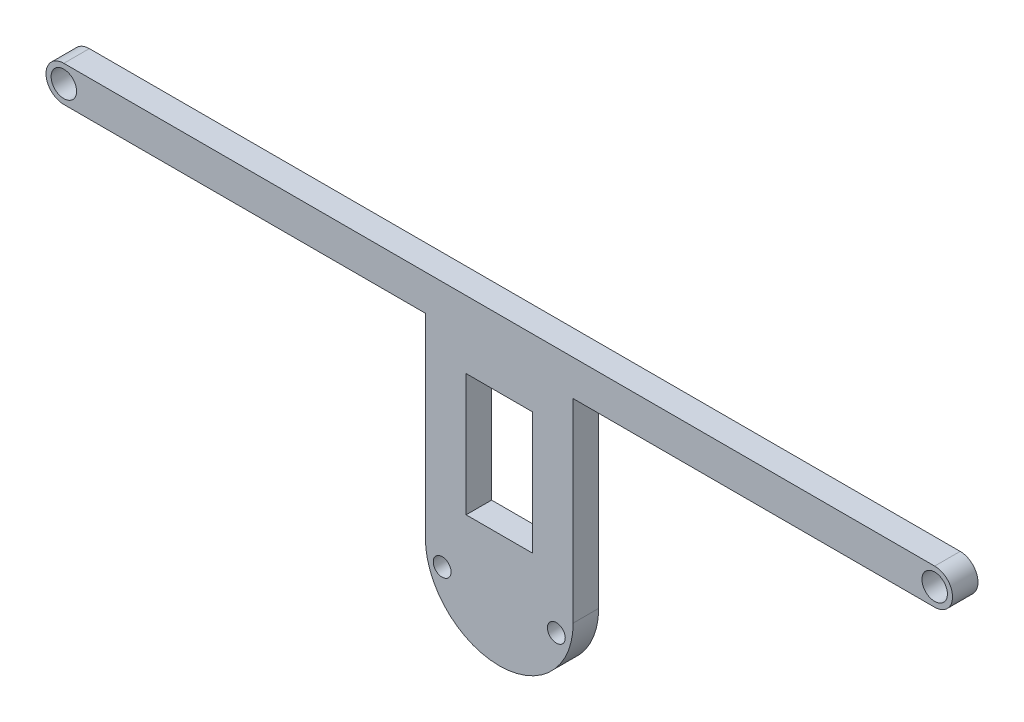
ISO-10303-21;
HEADER;
FILE_DESCRIPTION(('STEP AP214'),'2;1');
FILE_NAME('part.step','',(''),(''),'','','');
FILE_SCHEMA(('AUTOMOTIVE_DESIGN { 1 0 10303 214 1 1 1 1 }'));
ENDSEC;
DATA;
#1=APPLICATION_CONTEXT('core data for automotive mechanical design processes');
#2=APPLICATION_PROTOCOL_DEFINITION('international standard','automotive_design',2000,#1);
#3=PRODUCT_CONTEXT('',#1,'mechanical');
#4=PRODUCT('Part','Part','',(#3));
#5=PRODUCT_RELATED_PRODUCT_CATEGORY('part','',(#4));
#6=PRODUCT_DEFINITION_FORMATION('','',#4);
#7=PRODUCT_DEFINITION_CONTEXT('part definition',#1,'design');
#8=PRODUCT_DEFINITION('design','',#6,#7);
#9=PRODUCT_DEFINITION_SHAPE('','',#8);
#10=(LENGTH_UNIT() NAMED_UNIT(*) SI_UNIT(.MILLI.,.METRE.));
#11=(NAMED_UNIT(*) PLANE_ANGLE_UNIT() SI_UNIT($,.RADIAN.));
#12=(NAMED_UNIT(*) SI_UNIT($,.STERADIAN.) SOLID_ANGLE_UNIT());
#13=UNCERTAINTY_MEASURE_WITH_UNIT(LENGTH_MEASURE(1.E-05),#10,'distance_accuracy_value','');
#14=(GEOMETRIC_REPRESENTATION_CONTEXT(3) GLOBAL_UNCERTAINTY_ASSIGNED_CONTEXT((#13)) GLOBAL_UNIT_ASSIGNED_CONTEXT((#10,
#11,#12)) REPRESENTATION_CONTEXT('',''));
#15=CARTESIAN_POINT('',(0.,0.,0.));
#16=DIRECTION('',(0.,0.,1.));
#17=DIRECTION('',(1.,0.,0.));
#18=AXIS2_PLACEMENT_3D('',#15,#16,#17);
#19=CARTESIAN_POINT('',(-85.42,19.075,5.));
#20=DIRECTION('',(0.,0.,1.));
#21=DIRECTION('',(1.,0.,0.));
#22=AXIS2_PLACEMENT_3D('',#19,#20,#21);
#23=PLANE('',#22);
#24=CARTESIAN_POINT('',(-11.1994237541486,-25.8755762458514,5.));
#25=DIRECTION('',(0.,0.,1.));
#26=DIRECTION('',(1.,0.,0.));
#27=AXIS2_PLACEMENT_3D('',#24,#25,#26);
#28=CIRCLE('',#27,1.75);
#29=CARTESIAN_POINT('',(-9.44942375414862,-25.8755762458514,5.));
#30=VERTEX_POINT('',#29);
#31=EDGE_CURVE('E318',#30,#30,#28,.T.);
#32=ORIENTED_EDGE('',*,*,#31,.F.);
#33=EDGE_LOOP('',(#32));
#34=FACE_BOUND('',#33,.T.);
#35=CARTESIAN_POINT('',(-85.42,19.075,5.));
#36=DIRECTION('',(0.,0.,1.));
#37=DIRECTION('',(1.,0.,0.));
#38=AXIS2_PLACEMENT_3D('',#35,#36,#37);
#39=CIRCLE('',#38,2.49999999999999);
#40=CARTESIAN_POINT('',(-82.92,19.075,5.));
#41=VERTEX_POINT('',#40);
#42=EDGE_CURVE('E150',#41,#41,#39,.T.);
#43=ORIENTED_EDGE('',*,*,#42,.F.);
#44=EDGE_LOOP('',(#43));
#45=FACE_BOUND('',#44,.T.);
#46=CARTESIAN_POINT('',(-85.42,19.075,5.));
#47=DIRECTION('',(0.,0.,1.));
#48=DIRECTION('',(1.,0.,0.));
#49=AXIS2_PLACEMENT_3D('',#46,#47,#48);
#50=CIRCLE('',#49,3.50000000000001);
#51=CARTESIAN_POINT('',(-85.42,22.575,5.));
#52=VERTEX_POINT('',#51);
#53=CARTESIAN_POINT('',(-85.42,15.575,5.));
#54=VERTEX_POINT('',#53);
#55=EDGE_CURVE('E160',#52,#54,#50,.T.);
#56=ORIENTED_EDGE('',*,*,#55,.T.);
#57=DIRECTION('',(1.,0.,0.));
#58=VECTOR('',#57,1.);
#59=CARTESIAN_POINT('',(-85.42,15.575,5.));
#60=LINE('',#59,#58);
#61=CARTESIAN_POINT('',(-14.5,15.5749999999999,5.));
#62=VERTEX_POINT('',#61);
#63=EDGE_CURVE('E163',#54,#62,#60,.T.);
#64=ORIENTED_EDGE('',*,*,#63,.T.);
#65=DIRECTION('',(0.,-1.,0.));
#66=VECTOR('',#65,1.);
#67=CARTESIAN_POINT('',(-14.5,15.5749999999999,5.));
#68=LINE('',#67,#66);
#69=CARTESIAN_POINT('',(-14.5,-22.575,5.));
#70=VERTEX_POINT('',#69);
#71=EDGE_CURVE('E166',#62,#70,#68,.T.);
#72=ORIENTED_EDGE('',*,*,#71,.T.);
#73=CARTESIAN_POINT('',(0.,-22.575,5.));
#74=DIRECTION('',(0.,0.,1.));
#75=DIRECTION('',(1.,0.,0.));
#76=AXIS2_PLACEMENT_3D('',#73,#74,#75);
#77=CIRCLE('',#76,14.5);
#78=CARTESIAN_POINT('',(14.5,-22.575,5.));
#79=VERTEX_POINT('',#78);
#80=EDGE_CURVE('E168',#70,#79,#77,.T.);
#81=ORIENTED_EDGE('',*,*,#80,.T.);
#82=DIRECTION('',(0.,1.,0.));
#83=VECTOR('',#82,1.);
#84=CARTESIAN_POINT('',(14.5,15.575,5.));
#85=LINE('',#84,#83);
#86=CARTESIAN_POINT('',(14.5,15.575,5.));
#87=VERTEX_POINT('',#86);
#88=EDGE_CURVE('E170',#79,#87,#85,.T.);
#89=ORIENTED_EDGE('',*,*,#88,.T.);
#90=DIRECTION('',(1.,0.,0.));
#91=VECTOR('',#90,1.);
#92=CARTESIAN_POINT('',(14.5,15.575,5.));
#93=LINE('',#92,#91);
#94=CARTESIAN_POINT('',(85.42,15.575,5.));
#95=VERTEX_POINT('',#94);
#96=EDGE_CURVE('E172',#87,#95,#93,.T.);
#97=ORIENTED_EDGE('',*,*,#96,.T.);
#98=CARTESIAN_POINT('',(85.42,19.075,5.));
#99=DIRECTION('',(0.,0.,1.));
#100=DIRECTION('',(-1.,0.,0.));
#101=AXIS2_PLACEMENT_3D('',#98,#99,#100);
#102=CIRCLE('',#101,3.50000000000001);
#103=CARTESIAN_POINT('',(85.42,22.575,5.));
#104=VERTEX_POINT('',#103);
#105=EDGE_CURVE('E174',#95,#104,#102,.T.);
#106=ORIENTED_EDGE('',*,*,#105,.T.);
#107=DIRECTION('',(-1.,0.,0.));
#108=VECTOR('',#107,1.);
#109=CARTESIAN_POINT('',(-85.42,22.575,5.));
#110=LINE('',#109,#108);
#111=EDGE_CURVE('E176',#104,#52,#110,.T.);
#112=ORIENTED_EDGE('',*,*,#111,.T.);
#113=EDGE_LOOP('',(#56,#64,#72,#81,#89,#97,#106,#112));
#114=FACE_BOUND('',#113,.T.);
#115=DIRECTION('',(1.,0.,0.));
#116=VECTOR('',#115,1.);
#117=CARTESIAN_POINT('',(-6.49999999999999,-14.6761524917028,5.));
#118=LINE('',#117,#116);
#119=CARTESIAN_POINT('',(-6.49999999999999,-14.6761524917028,5.));
#120=VERTEX_POINT('',#119);
#121=CARTESIAN_POINT('',(6.5,-14.6761524917028,5.));
#122=VERTEX_POINT('',#121);
#123=EDGE_CURVE('E129',#120,#122,#118,.T.);
#124=ORIENTED_EDGE('',*,*,#123,.F.);
#125=DIRECTION('',(0.,-1.,0.));
#126=VECTOR('',#125,1.);
#127=CARTESIAN_POINT('',(-6.5,9.32384750829722,5.));
#128=LINE('',#127,#126);
#129=CARTESIAN_POINT('',(-6.5,9.32384750829722,5.));
#130=VERTEX_POINT('',#129);
#131=EDGE_CURVE('E121',#130,#120,#128,.T.);
#132=ORIENTED_EDGE('',*,*,#131,.F.);
#133=DIRECTION('',(-1.,0.,0.));
#134=VECTOR('',#133,1.);
#135=CARTESIAN_POINT('',(-6.5,9.32384750829722,5.));
#136=LINE('',#135,#134);
#137=CARTESIAN_POINT('',(6.50000000000001,9.32384750829722,5.));
#138=VERTEX_POINT('',#137);
#139=EDGE_CURVE('E144',#138,#130,#136,.T.);
#140=ORIENTED_EDGE('',*,*,#139,.F.);
#141=DIRECTION('',(0.,1.,0.));
#142=VECTOR('',#141,1.);
#143=CARTESIAN_POINT('',(6.5,9.32384750829722,5.));
#144=LINE('',#143,#142);
#145=EDGE_CURVE('E142',#122,#138,#144,.T.);
#146=ORIENTED_EDGE('',*,*,#145,.F.);
#147=EDGE_LOOP('',(#124,#132,#140,#146));
#148=FACE_BOUND('',#147,.T.);
#149=CARTESIAN_POINT('',(85.42,19.075,5.));
#150=DIRECTION('',(0.,0.,1.));
#151=DIRECTION('',(1.,0.,0.));
#152=AXIS2_PLACEMENT_3D('',#149,#150,#151);
#153=CIRCLE('',#152,2.49999999999999);
#154=CARTESIAN_POINT('',(87.92,19.075,5.));
#155=VERTEX_POINT('',#154);
#156=EDGE_CURVE('E324',#155,#155,#153,.T.);
#157=ORIENTED_EDGE('',*,*,#156,.F.);
#158=EDGE_LOOP('',(#157));
#159=FACE_BOUND('',#158,.T.);
#160=CARTESIAN_POINT('',(11.1994237541486,-25.8755762458514,5.));
#161=DIRECTION('',(0.,0.,1.));
#162=DIRECTION('',(1.,0.,0.));
#163=AXIS2_PLACEMENT_3D('',#160,#161,#162);
#164=CIRCLE('',#163,1.75);
#165=CARTESIAN_POINT('',(12.9494237541486,-25.8755762458514,5.));
#166=VERTEX_POINT('',#165);
#167=EDGE_CURVE('E309',#166,#166,#164,.T.);
#168=ORIENTED_EDGE('',*,*,#167,.F.);
#169=EDGE_LOOP('',(#168));
#170=FACE_BOUND('',#169,.T.);
#171=ADVANCED_FACE('F32',(#34,#45,#114,#148,#159,#170),#23,.T.);
#172=CARTESIAN_POINT('',(-85.42,19.075,0.));
#173=DIRECTION('',(0.,0.,1.));
#174=DIRECTION('',(1.,0.,0.));
#175=AXIS2_PLACEMENT_3D('',#172,#173,#174);
#176=PLANE('',#175);
#177=CARTESIAN_POINT('',(-85.42,19.075,0.));
#178=DIRECTION('',(0.,0.,1.));
#179=DIRECTION('',(1.,0.,0.));
#180=AXIS2_PLACEMENT_3D('',#177,#178,#179);
#181=CIRCLE('',#180,3.50000000000001);
#182=CARTESIAN_POINT('',(-85.42,22.575,0.));
#183=VERTEX_POINT('',#182);
#184=CARTESIAN_POINT('',(-85.42,15.575,0.));
#185=VERTEX_POINT('',#184);
#186=EDGE_CURVE('E137',#183,#185,#181,.T.);
#187=ORIENTED_EDGE('',*,*,#186,.F.);
#188=DIRECTION('',(-1.,0.,0.));
#189=VECTOR('',#188,1.);
#190=CARTESIAN_POINT('',(-85.42,22.575,0.));
#191=LINE('',#190,#189);
#192=CARTESIAN_POINT('',(85.42,22.575,0.));
#193=VERTEX_POINT('',#192);
#194=EDGE_CURVE('E164',#193,#183,#191,.T.);
#195=ORIENTED_EDGE('',*,*,#194,.F.);
#196=CARTESIAN_POINT('',(85.42,19.075,0.));
#197=DIRECTION('',(0.,0.,1.));
#198=DIRECTION('',(-1.,0.,0.));
#199=AXIS2_PLACEMENT_3D('',#196,#197,#198);
#200=CIRCLE('',#199,3.50000000000001);
#201=CARTESIAN_POINT('',(85.42,15.575,0.));
#202=VERTEX_POINT('',#201);
#203=EDGE_CURVE('E191',#202,#193,#200,.T.);
#204=ORIENTED_EDGE('',*,*,#203,.F.);
#205=DIRECTION('',(1.,0.,0.));
#206=VECTOR('',#205,1.);
#207=CARTESIAN_POINT('',(14.5,15.575,0.));
#208=LINE('',#207,#206);
#209=CARTESIAN_POINT('',(14.5,15.575,0.));
#210=VERTEX_POINT('',#209);
#211=EDGE_CURVE('E189',#210,#202,#208,.T.);
#212=ORIENTED_EDGE('',*,*,#211,.F.);
#213=DIRECTION('',(0.,1.,0.));
#214=VECTOR('',#213,1.);
#215=CARTESIAN_POINT('',(14.5,15.575,0.));
#216=LINE('',#215,#214);
#217=CARTESIAN_POINT('',(14.5,-22.575,0.));
#218=VERTEX_POINT('',#217);
#219=EDGE_CURVE('E187',#218,#210,#216,.T.);
#220=ORIENTED_EDGE('',*,*,#219,.F.);
#221=CARTESIAN_POINT('',(0.,-22.575,0.));
#222=DIRECTION('',(0.,0.,1.));
#223=DIRECTION('',(1.,0.,0.));
#224=AXIS2_PLACEMENT_3D('',#221,#222,#223);
#225=CIRCLE('',#224,14.5);
#226=CARTESIAN_POINT('',(-14.5,-22.575,0.));
#227=VERTEX_POINT('',#226);
#228=EDGE_CURVE('E185',#227,#218,#225,.T.);
#229=ORIENTED_EDGE('',*,*,#228,.F.);
#230=DIRECTION('',(0.,-1.,0.));
#231=VECTOR('',#230,1.);
#232=CARTESIAN_POINT('',(-14.5,15.5749999999999,0.));
#233=LINE('',#232,#231);
#234=CARTESIAN_POINT('',(-14.5,15.5749999999999,0.));
#235=VERTEX_POINT('',#234);
#236=EDGE_CURVE('E183',#235,#227,#233,.T.);
#237=ORIENTED_EDGE('',*,*,#236,.F.);
#238=DIRECTION('',(1.,0.,0.));
#239=VECTOR('',#238,1.);
#240=CARTESIAN_POINT('',(-85.42,15.575,0.));
#241=LINE('',#240,#239);
#242=EDGE_CURVE('E181',#185,#235,#241,.T.);
#243=ORIENTED_EDGE('',*,*,#242,.F.);
#244=EDGE_LOOP('',(#187,#195,#204,#212,#220,#229,#237,#243));
#245=FACE_BOUND('',#244,.T.);
#246=DIRECTION('',(0.,-1.,0.));
#247=VECTOR('',#246,1.);
#248=CARTESIAN_POINT('',(-6.5,9.32384750829722,0.));
#249=LINE('',#248,#247);
#250=CARTESIAN_POINT('',(-6.49999999999999,9.32384750829722,0.));
#251=VERTEX_POINT('',#250);
#252=CARTESIAN_POINT('',(-6.49999999999999,-14.6761524917028,0.));
#253=VERTEX_POINT('',#252);
#254=EDGE_CURVE('E55',#251,#253,#249,.T.);
#255=ORIENTED_EDGE('',*,*,#254,.T.);
#256=DIRECTION('',(1.,0.,0.));
#257=VECTOR('',#256,1.);
#258=CARTESIAN_POINT('',(-6.49999999999999,-14.6761524917028,0.));
#259=LINE('',#258,#257);
#260=CARTESIAN_POINT('',(6.5,-14.6761524917028,0.));
#261=VERTEX_POINT('',#260);
#262=EDGE_CURVE('E136',#253,#261,#259,.T.);
#263=ORIENTED_EDGE('',*,*,#262,.T.);
#264=DIRECTION('',(0.,1.,0.));
#265=VECTOR('',#264,1.);
#266=CARTESIAN_POINT('',(6.5,9.32384750829722,0.));
#267=LINE('',#266,#265);
#268=CARTESIAN_POINT('',(6.5,9.32384750829722,0.));
#269=VERTEX_POINT('',#268);
#270=EDGE_CURVE('E152',#261,#269,#267,.T.);
#271=ORIENTED_EDGE('',*,*,#270,.T.);
#272=DIRECTION('',(-1.,0.,0.));
#273=VECTOR('',#272,1.);
#274=CARTESIAN_POINT('',(-6.5,9.32384750829722,0.));
#275=LINE('',#274,#273);
#276=EDGE_CURVE('E130',#269,#251,#275,.T.);
#277=ORIENTED_EDGE('',*,*,#276,.T.);
#278=EDGE_LOOP('',(#255,#263,#271,#277));
#279=FACE_BOUND('',#278,.T.);
#280=CARTESIAN_POINT('',(-85.42,19.075,0.));
#281=DIRECTION('',(0.,0.,1.));
#282=DIRECTION('',(1.,0.,0.));
#283=AXIS2_PLACEMENT_3D('',#280,#281,#282);
#284=CIRCLE('',#283,2.49999999999999);
#285=CARTESIAN_POINT('',(-82.92,19.075,0.));
#286=VERTEX_POINT('',#285);
#287=EDGE_CURVE('E327',#286,#286,#284,.T.);
#288=ORIENTED_EDGE('',*,*,#287,.T.);
#289=EDGE_LOOP('',(#288));
#290=FACE_BOUND('',#289,.T.);
#291=CARTESIAN_POINT('',(85.42,19.075,0.));
#292=DIRECTION('',(0.,0.,1.));
#293=DIRECTION('',(1.,0.,0.));
#294=AXIS2_PLACEMENT_3D('',#291,#292,#293);
#295=CIRCLE('',#294,2.49999999999999);
#296=CARTESIAN_POINT('',(87.92,19.075,0.));
#297=VERTEX_POINT('',#296);
#298=EDGE_CURVE('E321',#297,#297,#295,.T.);
#299=ORIENTED_EDGE('',*,*,#298,.T.);
#300=EDGE_LOOP('',(#299));
#301=FACE_BOUND('',#300,.T.);
#302=CARTESIAN_POINT('',(-11.1994237541486,-25.8755762458514,0.));
#303=DIRECTION('',(0.,0.,1.));
#304=DIRECTION('',(1.,0.,0.));
#305=AXIS2_PLACEMENT_3D('',#302,#303,#304);
#306=CIRCLE('',#305,1.75);
#307=CARTESIAN_POINT('',(-9.44942375414862,-25.8755762458514,0.));
#308=VERTEX_POINT('',#307);
#309=EDGE_CURVE('E315',#308,#308,#306,.T.);
#310=ORIENTED_EDGE('',*,*,#309,.T.);
#311=EDGE_LOOP('',(#310));
#312=FACE_BOUND('',#311,.T.);
#313=CARTESIAN_POINT('',(11.1994237541486,-25.8755762458514,0.));
#314=DIRECTION('',(0.,0.,1.));
#315=DIRECTION('',(1.,0.,0.));
#316=AXIS2_PLACEMENT_3D('',#313,#314,#315);
#317=CIRCLE('',#316,1.75);
#318=CARTESIAN_POINT('',(12.9494237541486,-25.8755762458514,0.));
#319=VERTEX_POINT('',#318);
#320=EDGE_CURVE('E312',#319,#319,#317,.T.);
#321=ORIENTED_EDGE('',*,*,#320,.T.);
#322=EDGE_LOOP('',(#321));
#323=FACE_BOUND('',#322,.T.);
#324=ADVANCED_FACE('F221',(#245,#279,#290,#301,#312,#323),#176,.F.);
#325=CARTESIAN_POINT('',(-85.42,19.075,5.));
#326=DIRECTION('',(0.,0.,-1.));
#327=DIRECTION('',(-1.,0.,0.));
#328=AXIS2_PLACEMENT_3D('',#325,#326,#327);
#329=CYLINDRICAL_SURFACE('',#328,3.50000000000001);
#330=ORIENTED_EDGE('',*,*,#186,.T.);
#331=DIRECTION('',(0.,0.,-1.));
#332=VECTOR('',#331,1.);
#333=CARTESIAN_POINT('',(-85.42,15.575,5.));
#334=LINE('',#333,#332);
#335=EDGE_CURVE('E11',#54,#185,#334,.T.);
#336=ORIENTED_EDGE('',*,*,#335,.F.);
#337=ORIENTED_EDGE('',*,*,#55,.F.);
#338=DIRECTION('',(0.,0.,-1.));
#339=VECTOR('',#338,1.);
#340=CARTESIAN_POINT('',(-85.42,22.575,5.));
#341=LINE('',#340,#339);
#342=EDGE_CURVE('E178',#52,#183,#341,.T.);
#343=ORIENTED_EDGE('',*,*,#342,.T.);
#344=EDGE_LOOP('',(#330,#336,#337,#343));
#345=FACE_BOUND('',#344,.T.);
#346=ADVANCED_FACE('F34',(#345),#329,.T.);
#347=CARTESIAN_POINT('',(-85.42,15.575,5.));
#348=DIRECTION('',(0.,1.,0.));
#349=DIRECTION('',(-1.,0.,0.));
#350=AXIS2_PLACEMENT_3D('',#347,#348,#349);
#351=PLANE('',#350);
#352=ORIENTED_EDGE('',*,*,#242,.T.);
#353=DIRECTION('',(0.,0.,-1.));
#354=VECTOR('',#353,1.);
#355=CARTESIAN_POINT('',(-14.5,15.5749999999999,5.));
#356=LINE('',#355,#354);
#357=EDGE_CURVE('E40',#62,#235,#356,.T.);
#358=ORIENTED_EDGE('',*,*,#357,.F.);
#359=ORIENTED_EDGE('',*,*,#63,.F.);
#360=ORIENTED_EDGE('',*,*,#335,.T.);
#361=EDGE_LOOP('',(#352,#358,#359,#360));
#362=FACE_BOUND('',#361,.T.);
#363=ADVANCED_FACE('F238',(#362),#351,.F.);
#364=CARTESIAN_POINT('',(-14.5,15.5749999999999,5.));
#365=DIRECTION('',(1.,0.,0.));
#366=DIRECTION('',(0.,0.,-1.));
#367=AXIS2_PLACEMENT_3D('',#364,#365,#366);
#368=PLANE('',#367);
#369=ORIENTED_EDGE('',*,*,#236,.T.);
#370=DIRECTION('',(0.,0.,-1.));
#371=VECTOR('',#370,1.);
#372=CARTESIAN_POINT('',(-14.5,-22.575,5.));
#373=LINE('',#372,#371);
#374=EDGE_CURVE('E208',#70,#227,#373,.T.);
#375=ORIENTED_EDGE('',*,*,#374,.F.);
#376=ORIENTED_EDGE('',*,*,#71,.F.);
#377=ORIENTED_EDGE('',*,*,#357,.T.);
#378=EDGE_LOOP('',(#369,#375,#376,#377));
#379=FACE_BOUND('',#378,.T.);
#380=ADVANCED_FACE('F215',(#379),#368,.F.);
#381=CARTESIAN_POINT('',(0.,-22.575,5.));
#382=DIRECTION('',(0.,0.,-1.));
#383=DIRECTION('',(-1.,0.,0.));
#384=AXIS2_PLACEMENT_3D('',#381,#382,#383);
#385=CYLINDRICAL_SURFACE('',#384,14.5);
#386=ORIENTED_EDGE('',*,*,#228,.T.);
#387=DIRECTION('',(0.,0.,-1.));
#388=VECTOR('',#387,1.);
#389=CARTESIAN_POINT('',(14.5,-22.575,5.));
#390=LINE('',#389,#388);
#391=EDGE_CURVE('E205',#79,#218,#390,.T.);
#392=ORIENTED_EDGE('',*,*,#391,.F.);
#393=ORIENTED_EDGE('',*,*,#80,.F.);
#394=ORIENTED_EDGE('',*,*,#374,.T.);
#395=EDGE_LOOP('',(#386,#392,#393,#394));
#396=FACE_BOUND('',#395,.T.);
#397=ADVANCED_FACE('F227',(#396),#385,.T.);
#398=CARTESIAN_POINT('',(14.5,15.575,5.));
#399=DIRECTION('',(-1.,0.,0.));
#400=DIRECTION('',(0.,-1.,0.));
#401=AXIS2_PLACEMENT_3D('',#398,#399,#400);
#402=PLANE('',#401);
#403=ORIENTED_EDGE('',*,*,#219,.T.);
#404=DIRECTION('',(0.,0.,-1.));
#405=VECTOR('',#404,1.);
#406=CARTESIAN_POINT('',(14.5,15.575,5.));
#407=LINE('',#406,#405);
#408=EDGE_CURVE('E202',#87,#210,#407,.T.);
#409=ORIENTED_EDGE('',*,*,#408,.F.);
#410=ORIENTED_EDGE('',*,*,#88,.F.);
#411=ORIENTED_EDGE('',*,*,#391,.T.);
#412=EDGE_LOOP('',(#403,#409,#410,#411));
#413=FACE_BOUND('',#412,.T.);
#414=ADVANCED_FACE('F231',(#413),#402,.F.);
#415=CARTESIAN_POINT('',(14.5,15.575,5.));
#416=DIRECTION('',(0.,1.,0.));
#417=DIRECTION('',(0.,0.,1.));
#418=AXIS2_PLACEMENT_3D('',#415,#416,#417);
#419=PLANE('',#418);
#420=ORIENTED_EDGE('',*,*,#211,.T.);
#421=DIRECTION('',(0.,0.,-1.));
#422=VECTOR('',#421,1.);
#423=CARTESIAN_POINT('',(85.42,15.575,5.));
#424=LINE('',#423,#422);
#425=EDGE_CURVE('E199',#95,#202,#424,.T.);
#426=ORIENTED_EDGE('',*,*,#425,.F.);
#427=ORIENTED_EDGE('',*,*,#96,.F.);
#428=ORIENTED_EDGE('',*,*,#408,.T.);
#429=EDGE_LOOP('',(#420,#426,#427,#428));
#430=FACE_BOUND('',#429,.T.);
#431=ADVANCED_FACE('F251',(#430),#419,.F.);
#432=CARTESIAN_POINT('',(85.42,19.075,5.));
#433=DIRECTION('',(0.,0.,-1.));
#434=DIRECTION('',(-1.,0.,0.));
#435=AXIS2_PLACEMENT_3D('',#432,#433,#434);
#436=CYLINDRICAL_SURFACE('',#435,3.50000000000001);
#437=ORIENTED_EDGE('',*,*,#203,.T.);
#438=DIRECTION('',(0.,0.,-1.));
#439=VECTOR('',#438,1.);
#440=CARTESIAN_POINT('',(85.42,22.575,5.));
#441=LINE('',#440,#439);
#442=EDGE_CURVE('E196',#104,#193,#441,.T.);
#443=ORIENTED_EDGE('',*,*,#442,.F.);
#444=ORIENTED_EDGE('',*,*,#105,.F.);
#445=ORIENTED_EDGE('',*,*,#425,.T.);
#446=EDGE_LOOP('',(#437,#443,#444,#445));
#447=FACE_BOUND('',#446,.T.);
#448=ADVANCED_FACE('F249',(#447),#436,.T.);
#449=CARTESIAN_POINT('',(-85.42,22.575,5.));
#450=DIRECTION('',(0.,-1.,0.));
#451=DIRECTION('',(1.,0.,0.));
#452=AXIS2_PLACEMENT_3D('',#449,#450,#451);
#453=PLANE('',#452);
#454=ORIENTED_EDGE('',*,*,#194,.T.);
#455=ORIENTED_EDGE('',*,*,#342,.F.);
#456=ORIENTED_EDGE('',*,*,#111,.F.);
#457=ORIENTED_EDGE('',*,*,#442,.T.);
#458=EDGE_LOOP('',(#454,#455,#456,#457));
#459=FACE_BOUND('',#458,.T.);
#460=ADVANCED_FACE('F244',(#459),#453,.F.);
#461=CARTESIAN_POINT('',(-6.5,9.32384750829722,5.));
#462=DIRECTION('',(1.,0.,0.));
#463=DIRECTION('',(0.,1.,0.));
#464=AXIS2_PLACEMENT_3D('',#461,#462,#463);
#465=PLANE('',#464);
#466=ORIENTED_EDGE('',*,*,#254,.F.);
#467=DIRECTION('',(0.,0.,-1.));
#468=VECTOR('',#467,1.);
#469=CARTESIAN_POINT('',(-6.5,9.32384750829722,5.));
#470=LINE('',#469,#468);
#471=EDGE_CURVE('E125',#130,#251,#470,.T.);
#472=ORIENTED_EDGE('',*,*,#471,.F.);
#473=ORIENTED_EDGE('',*,*,#131,.T.);
#474=DIRECTION('',(0.,0.,-1.));
#475=VECTOR('',#474,1.);
#476=CARTESIAN_POINT('',(-6.49999999999999,-14.6761524917028,5.));
#477=LINE('',#476,#475);
#478=EDGE_CURVE('E124',#120,#253,#477,.T.);
#479=ORIENTED_EDGE('',*,*,#478,.T.);
#480=EDGE_LOOP('',(#466,#472,#473,#479));
#481=FACE_BOUND('',#480,.T.);
#482=ADVANCED_FACE('F123',(#481),#465,.T.);
#483=CARTESIAN_POINT('',(-6.49999999999999,-14.6761524917028,5.));
#484=DIRECTION('',(0.,1.,0.));
#485=DIRECTION('',(-1.,0.,0.));
#486=AXIS2_PLACEMENT_3D('',#483,#484,#485);
#487=PLANE('',#486);
#488=ORIENTED_EDGE('',*,*,#262,.F.);
#489=ORIENTED_EDGE('',*,*,#478,.F.);
#490=ORIENTED_EDGE('',*,*,#123,.T.);
#491=DIRECTION('',(0.,0.,-1.));
#492=VECTOR('',#491,1.);
#493=CARTESIAN_POINT('',(6.5,-14.6761524917028,5.));
#494=LINE('',#493,#492);
#495=EDGE_CURVE('E138',#122,#261,#494,.T.);
#496=ORIENTED_EDGE('',*,*,#495,.T.);
#497=EDGE_LOOP('',(#488,#489,#490,#496));
#498=FACE_BOUND('',#497,.T.);
#499=ADVANCED_FACE('F133',(#498),#487,.T.);
#500=CARTESIAN_POINT('',(6.5,9.32384750829722,5.));
#501=DIRECTION('',(-1.,0.,0.));
#502=DIRECTION('',(0.,-1.,0.));
#503=AXIS2_PLACEMENT_3D('',#500,#501,#502);
#504=PLANE('',#503);
#505=ORIENTED_EDGE('',*,*,#270,.F.);
#506=ORIENTED_EDGE('',*,*,#495,.F.);
#507=ORIENTED_EDGE('',*,*,#145,.T.);
#508=DIRECTION('',(0.,0.,-1.));
#509=VECTOR('',#508,1.);
#510=CARTESIAN_POINT('',(6.5,9.32384750829722,5.));
#511=LINE('',#510,#509);
#512=EDGE_CURVE('E47',#138,#269,#511,.T.);
#513=ORIENTED_EDGE('',*,*,#512,.T.);
#514=EDGE_LOOP('',(#505,#506,#507,#513));
#515=FACE_BOUND('',#514,.T.);
#516=ADVANCED_FACE('F279',(#515),#504,.T.);
#517=CARTESIAN_POINT('',(-6.5,9.32384750829722,5.));
#518=DIRECTION('',(0.,-1.,0.));
#519=DIRECTION('',(1.,0.,0.));
#520=AXIS2_PLACEMENT_3D('',#517,#518,#519);
#521=PLANE('',#520);
#522=ORIENTED_EDGE('',*,*,#276,.F.);
#523=ORIENTED_EDGE('',*,*,#512,.F.);
#524=ORIENTED_EDGE('',*,*,#139,.T.);
#525=ORIENTED_EDGE('',*,*,#471,.T.);
#526=EDGE_LOOP('',(#522,#523,#524,#525));
#527=FACE_BOUND('',#526,.T.);
#528=ADVANCED_FACE('F283',(#527),#521,.T.);
#529=CARTESIAN_POINT('',(-85.42,19.075,5.));
#530=DIRECTION('',(0.,0.,-1.));
#531=DIRECTION('',(-1.,0.,0.));
#532=AXIS2_PLACEMENT_3D('',#529,#530,#531);
#533=CYLINDRICAL_SURFACE('',#532,2.49999999999999);
#534=ORIENTED_EDGE('',*,*,#42,.T.);
#535=EDGE_LOOP('',(#534));
#536=FACE_BOUND('',#535,.T.);
#537=ORIENTED_EDGE('',*,*,#287,.F.);
#538=EDGE_LOOP('',(#537));
#539=FACE_BOUND('',#538,.T.);
#540=ADVANCED_FACE('F289',(#536,#539),#533,.F.);
#541=CARTESIAN_POINT('',(85.42,19.075,5.));
#542=DIRECTION('',(0.,0.,-1.));
#543=DIRECTION('',(-1.,0.,0.));
#544=AXIS2_PLACEMENT_3D('',#541,#542,#543);
#545=CYLINDRICAL_SURFACE('',#544,2.49999999999999);
#546=ORIENTED_EDGE('',*,*,#156,.T.);
#547=EDGE_LOOP('',(#546));
#548=FACE_BOUND('',#547,.T.);
#549=ORIENTED_EDGE('',*,*,#298,.F.);
#550=EDGE_LOOP('',(#549));
#551=FACE_BOUND('',#550,.T.);
#552=ADVANCED_FACE('F292',(#548,#551),#545,.F.);
#553=CARTESIAN_POINT('',(-11.1994237541486,-25.8755762458514,5.));
#554=DIRECTION('',(0.,0.,-1.));
#555=DIRECTION('',(-1.,0.,0.));
#556=AXIS2_PLACEMENT_3D('',#553,#554,#555);
#557=CYLINDRICAL_SURFACE('',#556,1.75);
#558=ORIENTED_EDGE('',*,*,#31,.T.);
#559=EDGE_LOOP('',(#558));
#560=FACE_BOUND('',#559,.T.);
#561=ORIENTED_EDGE('',*,*,#309,.F.);
#562=EDGE_LOOP('',(#561));
#563=FACE_BOUND('',#562,.T.);
#564=ADVANCED_FACE('F296',(#560,#563),#557,.F.);
#565=CARTESIAN_POINT('',(11.1994237541486,-25.8755762458514,5.));
#566=DIRECTION('',(0.,0.,-1.));
#567=DIRECTION('',(-1.,0.,0.));
#568=AXIS2_PLACEMENT_3D('',#565,#566,#567);
#569=CYLINDRICAL_SURFACE('',#568,1.75);
#570=ORIENTED_EDGE('',*,*,#167,.T.);
#571=EDGE_LOOP('',(#570));
#572=FACE_BOUND('',#571,.T.);
#573=ORIENTED_EDGE('',*,*,#320,.F.);
#574=EDGE_LOOP('',(#573));
#575=FACE_BOUND('',#574,.T.);
#576=ADVANCED_FACE('F300',(#572,#575),#569,.F.);
#577=CLOSED_SHELL('',(#171,#324,#346,#363,#380,#397,#414,#431,#448,#460,#482,#499,#516,#528,
#540,#552,#564,#576));
#578=MANIFOLD_SOLID_BREP('B2',#577);
#579=ADVANCED_BREP_SHAPE_REPRESENTATION('',(#18,#578),#14);
#580=SHAPE_DEFINITION_REPRESENTATION(#9,#579);
ENDSEC;
END-ISO-10303-21;
